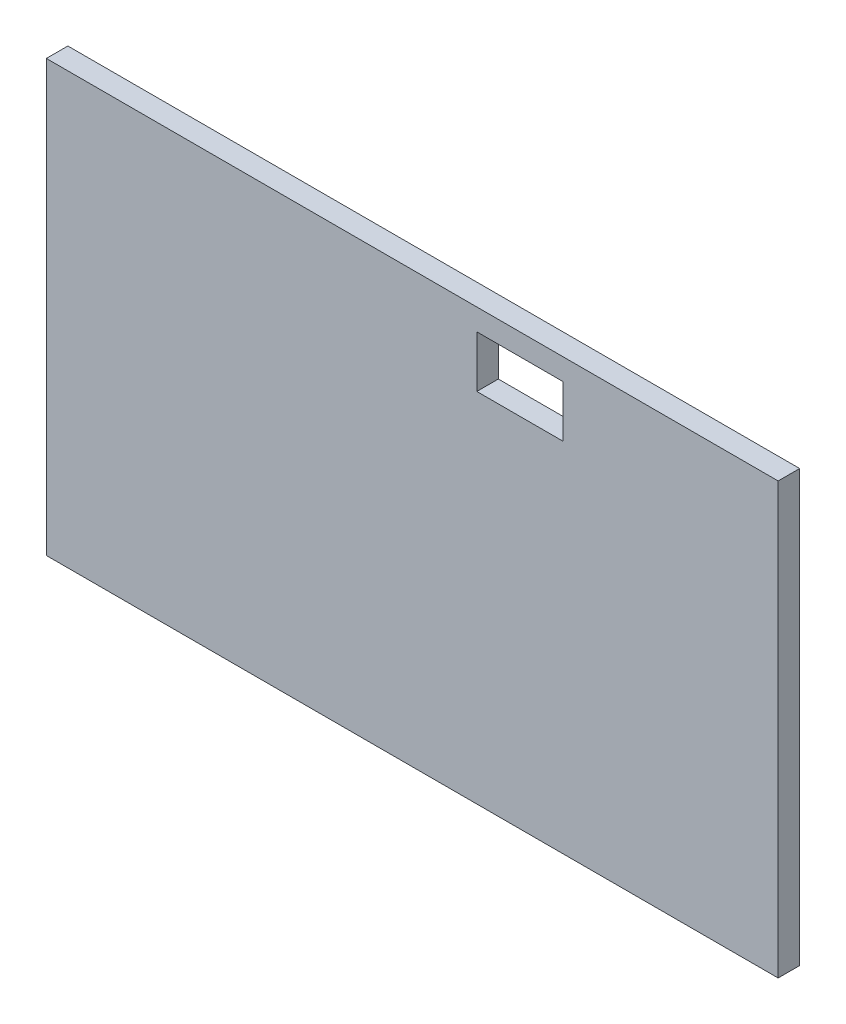
ISO-10303-21;
HEADER;
FILE_DESCRIPTION(('STEP AP214'),'2;1');
FILE_NAME('part.step','',(''),(''),'','','');
FILE_SCHEMA(('AUTOMOTIVE_DESIGN { 1 0 10303 214 1 1 1 1 }'));
ENDSEC;
DATA;
#1=APPLICATION_CONTEXT('core data for automotive mechanical design processes');
#2=APPLICATION_PROTOCOL_DEFINITION('international standard','automotive_design',2000,#1);
#3=PRODUCT_CONTEXT('',#1,'mechanical');
#4=PRODUCT('Part','Part','',(#3));
#5=PRODUCT_RELATED_PRODUCT_CATEGORY('part','',(#4));
#6=PRODUCT_DEFINITION_FORMATION('','',#4);
#7=PRODUCT_DEFINITION_CONTEXT('part definition',#1,'design');
#8=PRODUCT_DEFINITION('design','',#6,#7);
#9=PRODUCT_DEFINITION_SHAPE('','',#8);
#10=(LENGTH_UNIT() NAMED_UNIT(*) SI_UNIT(.MILLI.,.METRE.));
#11=(NAMED_UNIT(*) PLANE_ANGLE_UNIT() SI_UNIT($,.RADIAN.));
#12=(NAMED_UNIT(*) SI_UNIT($,.STERADIAN.) SOLID_ANGLE_UNIT());
#13=UNCERTAINTY_MEASURE_WITH_UNIT(LENGTH_MEASURE(1.E-05),#10,'distance_accuracy_value','');
#14=(GEOMETRIC_REPRESENTATION_CONTEXT(3) GLOBAL_UNCERTAINTY_ASSIGNED_CONTEXT((#13)) GLOBAL_UNIT_ASSIGNED_CONTEXT((#10,
#11,#12)) REPRESENTATION_CONTEXT('',''));
#15=CARTESIAN_POINT('',(0.,0.,0.));
#16=DIRECTION('',(0.,0.,1.));
#17=DIRECTION('',(1.,0.,0.));
#18=AXIS2_PLACEMENT_3D('',#15,#16,#17);
#19=CARTESIAN_POINT('',(0.,0.,5.));
#20=DIRECTION('',(0.,0.,1.));
#21=DIRECTION('',(1.,0.,0.));
#22=AXIS2_PLACEMENT_3D('',#19,#20,#21);
#23=PLANE('',#22);
#24=DIRECTION('',(0.,-1.,0.));
#25=VECTOR('',#24,1.);
#26=CARTESIAN_POINT('',(0.,100.,5.));
#27=LINE('',#26,#25);
#28=CARTESIAN_POINT('',(0.,100.,5.));
#29=VERTEX_POINT('',#28);
#30=CARTESIAN_POINT('',(0.,0.,5.));
#31=VERTEX_POINT('',#30);
#32=EDGE_CURVE('E138',#29,#31,#27,.T.);
#33=ORIENTED_EDGE('',*,*,#32,.T.);
#34=DIRECTION('',(1.,0.,0.));
#35=VECTOR('',#34,1.);
#36=CARTESIAN_POINT('',(0.,0.,5.));
#37=LINE('',#36,#35);
#38=CARTESIAN_POINT('',(170.,0.,5.));
#39=VERTEX_POINT('',#38);
#40=EDGE_CURVE('E141',#31,#39,#37,.T.);
#41=ORIENTED_EDGE('',*,*,#40,.T.);
#42=DIRECTION('',(0.,1.,0.));
#43=VECTOR('',#42,1.);
#44=CARTESIAN_POINT('',(170.,0.,5.));
#45=LINE('',#44,#43);
#46=CARTESIAN_POINT('',(170.,100.,5.));
#47=VERTEX_POINT('',#46);
#48=EDGE_CURVE('E144',#39,#47,#45,.T.);
#49=ORIENTED_EDGE('',*,*,#48,.T.);
#50=DIRECTION('',(-1.,0.,0.));
#51=VECTOR('',#50,1.);
#52=CARTESIAN_POINT('',(170.,100.,5.));
#53=LINE('',#52,#51);
#54=EDGE_CURVE('E146',#47,#29,#53,.T.);
#55=ORIENTED_EDGE('',*,*,#54,.T.);
#56=EDGE_LOOP('',(#33,#41,#49,#55));
#57=FACE_BOUND('',#56,.T.);
#58=DIRECTION('',(-1.,0.,0.));
#59=VECTOR('',#58,1.);
#60=CARTESIAN_POINT('',(100.,95.,5.));
#61=LINE('',#60,#59);
#62=CARTESIAN_POINT('',(120.,95.,5.));
#63=VERTEX_POINT('',#62);
#64=CARTESIAN_POINT('',(100.,95.,5.));
#65=VERTEX_POINT('',#64);
#66=EDGE_CURVE('E110',#63,#65,#61,.T.);
#67=ORIENTED_EDGE('',*,*,#66,.F.);
#68=DIRECTION('',(0.,1.,0.));
#69=VECTOR('',#68,1.);
#70=CARTESIAN_POINT('',(120.,83.,5.));
#71=LINE('',#70,#69);
#72=CARTESIAN_POINT('',(120.,83.,5.));
#73=VERTEX_POINT('',#72);
#74=EDGE_CURVE('E102',#73,#63,#71,.T.);
#75=ORIENTED_EDGE('',*,*,#74,.F.);
#76=DIRECTION('',(1.,0.,0.));
#77=VECTOR('',#76,1.);
#78=CARTESIAN_POINT('',(100.,83.,5.));
#79=LINE('',#78,#77);
#80=CARTESIAN_POINT('',(100.,83.,5.));
#81=VERTEX_POINT('',#80);
#82=EDGE_CURVE('E124',#81,#73,#79,.T.);
#83=ORIENTED_EDGE('',*,*,#82,.F.);
#84=DIRECTION('',(0.,-1.,0.));
#85=VECTOR('',#84,1.);
#86=CARTESIAN_POINT('',(100.,83.,5.));
#87=LINE('',#86,#85);
#88=EDGE_CURVE('E122',#65,#81,#87,.T.);
#89=ORIENTED_EDGE('',*,*,#88,.F.);
#90=EDGE_LOOP('',(#67,#75,#83,#89));
#91=FACE_BOUND('',#90,.T.);
#92=ADVANCED_FACE('F37',(#57,#91),#23,.T.);
#93=CARTESIAN_POINT('',(0.,0.,0.));
#94=DIRECTION('',(0.,0.,1.));
#95=DIRECTION('',(1.,0.,0.));
#96=AXIS2_PLACEMENT_3D('',#93,#94,#95);
#97=PLANE('',#96);
#98=DIRECTION('',(0.,-1.,0.));
#99=VECTOR('',#98,1.);
#100=CARTESIAN_POINT('',(0.,100.,0.));
#101=LINE('',#100,#99);
#102=CARTESIAN_POINT('',(0.,100.,0.));
#103=VERTEX_POINT('',#102);
#104=CARTESIAN_POINT('',(0.,0.,0.));
#105=VERTEX_POINT('',#104);
#106=EDGE_CURVE('E118',#103,#105,#101,.T.);
#107=ORIENTED_EDGE('',*,*,#106,.F.);
#108=DIRECTION('',(-1.,0.,0.));
#109=VECTOR('',#108,1.);
#110=CARTESIAN_POINT('',(170.,100.,0.));
#111=LINE('',#110,#109);
#112=CARTESIAN_POINT('',(170.,100.,0.));
#113=VERTEX_POINT('',#112);
#114=EDGE_CURVE('E142',#113,#103,#111,.T.);
#115=ORIENTED_EDGE('',*,*,#114,.F.);
#116=DIRECTION('',(0.,1.,0.));
#117=VECTOR('',#116,1.);
#118=CARTESIAN_POINT('',(170.,0.,0.));
#119=LINE('',#118,#117);
#120=CARTESIAN_POINT('',(170.,0.,0.));
#121=VERTEX_POINT('',#120);
#122=EDGE_CURVE('E153',#121,#113,#119,.T.);
#123=ORIENTED_EDGE('',*,*,#122,.F.);
#124=DIRECTION('',(1.,0.,0.));
#125=VECTOR('',#124,1.);
#126=CARTESIAN_POINT('',(0.,0.,0.));
#127=LINE('',#126,#125);
#128=EDGE_CURVE('E151',#105,#121,#127,.T.);
#129=ORIENTED_EDGE('',*,*,#128,.F.);
#130=EDGE_LOOP('',(#107,#115,#123,#129));
#131=FACE_BOUND('',#130,.T.);
#132=DIRECTION('',(0.,1.,0.));
#133=VECTOR('',#132,1.);
#134=CARTESIAN_POINT('',(120.,83.,0.));
#135=LINE('',#134,#133);
#136=CARTESIAN_POINT('',(120.,83.,0.));
#137=VERTEX_POINT('',#136);
#138=CARTESIAN_POINT('',(120.,95.,0.));
#139=VERTEX_POINT('',#138);
#140=EDGE_CURVE('E60',#137,#139,#135,.T.);
#141=ORIENTED_EDGE('',*,*,#140,.T.);
#142=DIRECTION('',(-1.,0.,0.));
#143=VECTOR('',#142,1.);
#144=CARTESIAN_POINT('',(100.,95.,0.));
#145=LINE('',#144,#143);
#146=CARTESIAN_POINT('',(100.,95.,0.));
#147=VERTEX_POINT('',#146);
#148=EDGE_CURVE('E117',#139,#147,#145,.T.);
#149=ORIENTED_EDGE('',*,*,#148,.T.);
#150=DIRECTION('',(0.,-1.,0.));
#151=VECTOR('',#150,1.);
#152=CARTESIAN_POINT('',(100.,83.,0.));
#153=LINE('',#152,#151);
#154=CARTESIAN_POINT('',(100.,83.,0.));
#155=VERTEX_POINT('',#154);
#156=EDGE_CURVE('E130',#147,#155,#153,.T.);
#157=ORIENTED_EDGE('',*,*,#156,.T.);
#158=DIRECTION('',(1.,0.,0.));
#159=VECTOR('',#158,1.);
#160=CARTESIAN_POINT('',(100.,83.,0.));
#161=LINE('',#160,#159);
#162=EDGE_CURVE('E111',#155,#137,#161,.T.);
#163=ORIENTED_EDGE('',*,*,#162,.T.);
#164=EDGE_LOOP('',(#141,#149,#157,#163));
#165=FACE_BOUND('',#164,.T.);
#166=ADVANCED_FACE('F171',(#131,#165),#97,.F.);
#167=CARTESIAN_POINT('',(0.,100.,5.));
#168=DIRECTION('',(1.,0.,0.));
#169=DIRECTION('',(0.,0.,-1.));
#170=AXIS2_PLACEMENT_3D('',#167,#168,#169);
#171=PLANE('',#170);
#172=ORIENTED_EDGE('',*,*,#106,.T.);
#173=DIRECTION('',(0.,0.,-1.));
#174=VECTOR('',#173,1.);
#175=CARTESIAN_POINT('',(0.,0.,5.));
#176=LINE('',#175,#174);
#177=EDGE_CURVE('E11',#31,#105,#176,.T.);
#178=ORIENTED_EDGE('',*,*,#177,.F.);
#179=ORIENTED_EDGE('',*,*,#32,.F.);
#180=DIRECTION('',(0.,0.,-1.));
#181=VECTOR('',#180,1.);
#182=CARTESIAN_POINT('',(0.,100.,5.));
#183=LINE('',#182,#181);
#184=EDGE_CURVE('E148',#29,#103,#183,.T.);
#185=ORIENTED_EDGE('',*,*,#184,.T.);
#186=EDGE_LOOP('',(#172,#178,#179,#185));
#187=FACE_BOUND('',#186,.T.);
#188=ADVANCED_FACE('F39',(#187),#171,.F.);
#189=CARTESIAN_POINT('',(0.,0.,5.));
#190=DIRECTION('',(0.,1.,0.));
#191=DIRECTION('',(0.,0.,1.));
#192=AXIS2_PLACEMENT_3D('',#189,#190,#191);
#193=PLANE('',#192);
#194=ORIENTED_EDGE('',*,*,#128,.T.);
#195=DIRECTION('',(0.,0.,-1.));
#196=VECTOR('',#195,1.);
#197=CARTESIAN_POINT('',(170.,0.,5.));
#198=LINE('',#197,#196);
#199=EDGE_CURVE('E45',#39,#121,#198,.T.);
#200=ORIENTED_EDGE('',*,*,#199,.F.);
#201=ORIENTED_EDGE('',*,*,#40,.F.);
#202=ORIENTED_EDGE('',*,*,#177,.T.);
#203=EDGE_LOOP('',(#194,#200,#201,#202));
#204=FACE_BOUND('',#203,.T.);
#205=ADVANCED_FACE('F181',(#204),#193,.F.);
#206=CARTESIAN_POINT('',(170.,0.,5.));
#207=DIRECTION('',(-1.,0.,0.));
#208=DIRECTION('',(0.,-1.,0.));
#209=AXIS2_PLACEMENT_3D('',#206,#207,#208);
#210=PLANE('',#209);
#211=ORIENTED_EDGE('',*,*,#122,.T.);
#212=DIRECTION('',(0.,0.,-1.));
#213=VECTOR('',#212,1.);
#214=CARTESIAN_POINT('',(170.,100.,5.));
#215=LINE('',#214,#213);
#216=EDGE_CURVE('E158',#47,#113,#215,.T.);
#217=ORIENTED_EDGE('',*,*,#216,.F.);
#218=ORIENTED_EDGE('',*,*,#48,.F.);
#219=ORIENTED_EDGE('',*,*,#199,.T.);
#220=EDGE_LOOP('',(#211,#217,#218,#219));
#221=FACE_BOUND('',#220,.T.);
#222=ADVANCED_FACE('F165',(#221),#210,.F.);
#223=CARTESIAN_POINT('',(170.,100.,5.));
#224=DIRECTION('',(0.,-1.,0.));
#225=DIRECTION('',(1.,0.,0.));
#226=AXIS2_PLACEMENT_3D('',#223,#224,#225);
#227=PLANE('',#226);
#228=ORIENTED_EDGE('',*,*,#114,.T.);
#229=ORIENTED_EDGE('',*,*,#184,.F.);
#230=ORIENTED_EDGE('',*,*,#54,.F.);
#231=ORIENTED_EDGE('',*,*,#216,.T.);
#232=EDGE_LOOP('',(#228,#229,#230,#231));
#233=FACE_BOUND('',#232,.T.);
#234=ADVANCED_FACE('F175',(#233),#227,.F.);
#235=CARTESIAN_POINT('',(120.,83.,5.));
#236=DIRECTION('',(-1.,0.,0.));
#237=DIRECTION('',(0.,0.,1.));
#238=AXIS2_PLACEMENT_3D('',#235,#236,#237);
#239=PLANE('',#238);
#240=ORIENTED_EDGE('',*,*,#140,.F.);
#241=DIRECTION('',(0.,0.,-1.));
#242=VECTOR('',#241,1.);
#243=CARTESIAN_POINT('',(120.,83.,5.));
#244=LINE('',#243,#242);
#245=EDGE_CURVE('E106',#73,#137,#244,.T.);
#246=ORIENTED_EDGE('',*,*,#245,.F.);
#247=ORIENTED_EDGE('',*,*,#74,.T.);
#248=DIRECTION('',(0.,0.,-1.));
#249=VECTOR('',#248,1.);
#250=CARTESIAN_POINT('',(120.,95.,5.));
#251=LINE('',#250,#249);
#252=EDGE_CURVE('E105',#63,#139,#251,.T.);
#253=ORIENTED_EDGE('',*,*,#252,.T.);
#254=EDGE_LOOP('',(#240,#246,#247,#253));
#255=FACE_BOUND('',#254,.T.);
#256=ADVANCED_FACE('F104',(#255),#239,.T.);
#257=CARTESIAN_POINT('',(100.,95.,5.));
#258=DIRECTION('',(0.,-1.,0.));
#259=DIRECTION('',(0.,0.,-1.));
#260=AXIS2_PLACEMENT_3D('',#257,#258,#259);
#261=PLANE('',#260);
#262=ORIENTED_EDGE('',*,*,#148,.F.);
#263=ORIENTED_EDGE('',*,*,#252,.F.);
#264=ORIENTED_EDGE('',*,*,#66,.T.);
#265=DIRECTION('',(0.,0.,-1.));
#266=VECTOR('',#265,1.);
#267=CARTESIAN_POINT('',(100.,95.,5.));
#268=LINE('',#267,#266);
#269=EDGE_CURVE('E119',#65,#147,#268,.T.);
#270=ORIENTED_EDGE('',*,*,#269,.T.);
#271=EDGE_LOOP('',(#262,#263,#264,#270));
#272=FACE_BOUND('',#271,.T.);
#273=ADVANCED_FACE('F114',(#272),#261,.T.);
#274=CARTESIAN_POINT('',(100.,83.,5.));
#275=DIRECTION('',(1.,0.,0.));
#276=DIRECTION('',(0.,0.,-1.));
#277=AXIS2_PLACEMENT_3D('',#274,#275,#276);
#278=PLANE('',#277);
#279=ORIENTED_EDGE('',*,*,#156,.F.);
#280=ORIENTED_EDGE('',*,*,#269,.F.);
#281=ORIENTED_EDGE('',*,*,#88,.T.);
#282=DIRECTION('',(0.,0.,-1.));
#283=VECTOR('',#282,1.);
#284=CARTESIAN_POINT('',(100.,83.,5.));
#285=LINE('',#284,#283);
#286=EDGE_CURVE('E52',#81,#155,#285,.T.);
#287=ORIENTED_EDGE('',*,*,#286,.T.);
#288=EDGE_LOOP('',(#279,#280,#281,#287));
#289=FACE_BOUND('',#288,.T.);
#290=ADVANCED_FACE('F204',(#289),#278,.T.);
#291=CARTESIAN_POINT('',(100.,83.,5.));
#292=DIRECTION('',(0.,1.,0.));
#293=DIRECTION('',(0.,0.,1.));
#294=AXIS2_PLACEMENT_3D('',#291,#292,#293);
#295=PLANE('',#294);
#296=ORIENTED_EDGE('',*,*,#162,.F.);
#297=ORIENTED_EDGE('',*,*,#286,.F.);
#298=ORIENTED_EDGE('',*,*,#82,.T.);
#299=ORIENTED_EDGE('',*,*,#245,.T.);
#300=EDGE_LOOP('',(#296,#297,#298,#299));
#301=FACE_BOUND('',#300,.T.);
#302=ADVANCED_FACE('F208',(#301),#295,.T.);
#303=CLOSED_SHELL('',(#92,#166,#188,#205,#222,#234,#256,#273,#290,#302));
#304=MANIFOLD_SOLID_BREP('B2',#303);
#305=ADVANCED_BREP_SHAPE_REPRESENTATION('',(#18,#304),#14);
#306=SHAPE_DEFINITION_REPRESENTATION(#9,#305);
ENDSEC;
END-ISO-10303-21;
